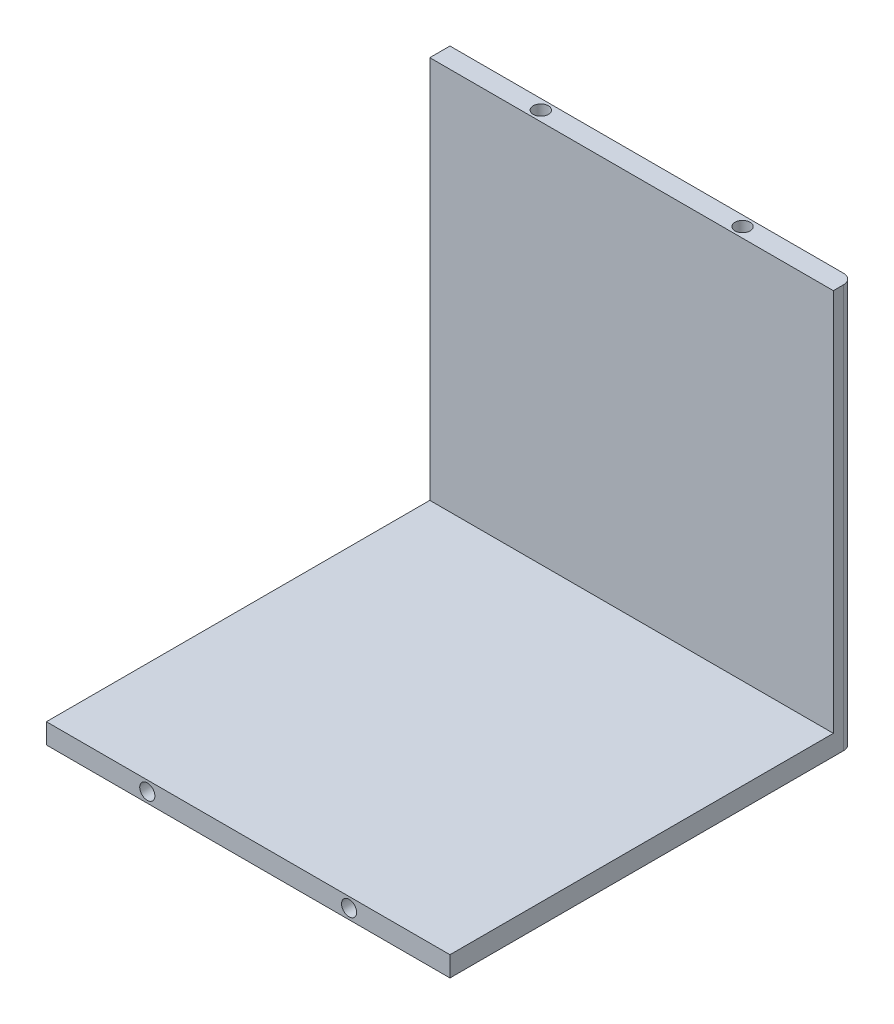
ISO-10303-21;
HEADER;
FILE_DESCRIPTION(('STEP AP214'),'2;1');
FILE_NAME('part.step','',(''),(''),'','','');
FILE_SCHEMA(('AUTOMOTIVE_DESIGN { 1 0 10303 214 1 1 1 1 }'));
ENDSEC;
DATA;
#1=APPLICATION_CONTEXT('core data for automotive mechanical design processes');
#2=APPLICATION_PROTOCOL_DEFINITION('international standard','automotive_design',2000,#1);
#3=PRODUCT_CONTEXT('',#1,'mechanical');
#4=PRODUCT('Part','Part','',(#3));
#5=PRODUCT_RELATED_PRODUCT_CATEGORY('part','',(#4));
#6=PRODUCT_DEFINITION_FORMATION('','',#4);
#7=PRODUCT_DEFINITION_CONTEXT('part definition',#1,'design');
#8=PRODUCT_DEFINITION('design','',#6,#7);
#9=PRODUCT_DEFINITION_SHAPE('','',#8);
#10=(LENGTH_UNIT() NAMED_UNIT(*) SI_UNIT(.MILLI.,.METRE.));
#11=(NAMED_UNIT(*) PLANE_ANGLE_UNIT() SI_UNIT($,.RADIAN.));
#12=(NAMED_UNIT(*) SI_UNIT($,.STERADIAN.) SOLID_ANGLE_UNIT());
#13=UNCERTAINTY_MEASURE_WITH_UNIT(LENGTH_MEASURE(1.E-05),#10,'distance_accuracy_value','');
#14=(GEOMETRIC_REPRESENTATION_CONTEXT(3) GLOBAL_UNCERTAINTY_ASSIGNED_CONTEXT((#13)) GLOBAL_UNIT_ASSIGNED_CONTEXT((#10,
#11,#12)) REPRESENTATION_CONTEXT('',''));
#15=CARTESIAN_POINT('',(0.,0.,0.));
#16=DIRECTION('',(0.,0.,1.));
#17=DIRECTION('',(1.,0.,0.));
#18=AXIS2_PLACEMENT_3D('',#15,#16,#17);
#19=CARTESIAN_POINT('',(80.,-2.,0.));
#20=DIRECTION('',(0.,-1.,0.));
#21=DIRECTION('',(0.,0.,-1.));
#22=AXIS2_PLACEMENT_3D('',#19,#20,#21);
#23=PLANE('',#22);
#24=CARTESIAN_POINT('',(76.25,-1.99999999999999,-103.5));
#25=DIRECTION('',(0.,-1.,0.));
#26=DIRECTION('',(0.,0.,-1.));
#27=AXIS2_PLACEMENT_3D('',#24,#25,#26);
#28=CIRCLE('',#27,0.749999999999999);
#29=CARTESIAN_POINT('',(76.25,-1.99999999999999,-104.25));
#30=VERTEX_POINT('',#29);
#31=EDGE_CURVE('E252',#30,#30,#28,.T.);
#32=ORIENTED_EDGE('',*,*,#31,.F.);
#33=EDGE_LOOP('',(#32));
#34=FACE_BOUND('',#33,.T.);
#35=DIRECTION('',(0.,0.,1.));
#36=VECTOR('',#35,1.);
#37=CARTESIAN_POINT('',(80.,-2.,0.));
#38=LINE('',#37,#36);
#39=CARTESIAN_POINT('',(80.,-1.99999999999999,-109.));
#40=VERTEX_POINT('',#39);
#41=CARTESIAN_POINT('',(80.,-2.,-70.));
#42=VERTEX_POINT('',#41);
#43=EDGE_CURVE('E151',#40,#42,#38,.T.);
#44=ORIENTED_EDGE('',*,*,#43,.T.);
#45=DIRECTION('',(1.,0.,0.));
#46=VECTOR('',#45,1.);
#47=CARTESIAN_POINT('',(40.,-2.,-70.));
#48=LINE('',#47,#46);
#49=CARTESIAN_POINT('',(40.,-2.,-70.));
#50=VERTEX_POINT('',#49);
#51=EDGE_CURVE('E137',#50,#42,#48,.T.);
#52=ORIENTED_EDGE('',*,*,#51,.F.);
#53=DIRECTION('',(0.,0.,1.));
#54=VECTOR('',#53,1.);
#55=CARTESIAN_POINT('',(40.,-2.,-110.));
#56=LINE('',#55,#54);
#57=CARTESIAN_POINT('',(40.,-2.,-110.));
#58=VERTEX_POINT('',#57);
#59=EDGE_CURVE('E148',#58,#50,#56,.T.);
#60=ORIENTED_EDGE('',*,*,#59,.F.);
#61=DIRECTION('',(-1.,0.,0.));
#62=VECTOR('',#61,1.);
#63=CARTESIAN_POINT('',(80.,-1.99999999999999,-110.));
#64=LINE('',#63,#62);
#65=CARTESIAN_POINT('',(79.,-1.99999999999999,-110.));
#66=VERTEX_POINT('',#65);
#67=EDGE_CURVE('E182',#66,#58,#64,.T.);
#68=ORIENTED_EDGE('',*,*,#67,.F.);
#69=CARTESIAN_POINT('',(79.,-1.99999999999999,-109.));
#70=DIRECTION('',(0.,-1.,0.));
#71=DIRECTION('',(0.,0.,-1.));
#72=AXIS2_PLACEMENT_3D('',#69,#70,#71);
#73=CIRCLE('',#72,1.);
#74=EDGE_CURVE('E184',#66,#40,#73,.T.);
#75=ORIENTED_EDGE('',*,*,#74,.T.);
#76=EDGE_LOOP('',(#44,#52,#60,#68,#75));
#77=FACE_BOUND('',#76,.T.);
#78=ADVANCED_FACE('F79',(#34,#77),#23,.T.);
#79=CARTESIAN_POINT('',(80.,0.,0.));
#80=DIRECTION('',(0.,1.,0.));
#81=DIRECTION('',(0.,0.,1.));
#82=AXIS2_PLACEMENT_3D('',#79,#80,#81);
#83=PLANE('',#82);
#84=DIRECTION('',(0.,0.,1.));
#85=VECTOR('',#84,1.);
#86=CARTESIAN_POINT('',(40.,0.,0.));
#87=LINE('',#86,#85);
#88=CARTESIAN_POINT('',(40.,0.,-108.));
#89=VERTEX_POINT('',#88);
#90=CARTESIAN_POINT('',(40.,0.,-70.));
#91=VERTEX_POINT('',#90);
#92=EDGE_CURVE('E168',#89,#91,#87,.T.);
#93=ORIENTED_EDGE('',*,*,#92,.T.);
#94=DIRECTION('',(-1.,0.,0.));
#95=VECTOR('',#94,1.);
#96=CARTESIAN_POINT('',(40.,0.,-70.));
#97=LINE('',#96,#95);
#98=CARTESIAN_POINT('',(80.,0.,-70.));
#99=VERTEX_POINT('',#98);
#100=EDGE_CURVE('E94',#99,#91,#97,.T.);
#101=ORIENTED_EDGE('',*,*,#100,.F.);
#102=DIRECTION('',(0.,0.,-1.));
#103=VECTOR('',#102,1.);
#104=CARTESIAN_POINT('',(80.,0.,0.));
#105=LINE('',#104,#103);
#106=CARTESIAN_POINT('',(80.,0.,-108.));
#107=VERTEX_POINT('',#106);
#108=EDGE_CURVE('E177',#99,#107,#105,.T.);
#109=ORIENTED_EDGE('',*,*,#108,.T.);
#110=DIRECTION('',(-1.,0.,0.));
#111=VECTOR('',#110,1.);
#112=CARTESIAN_POINT('',(80.,0.,-108.));
#113=LINE('',#112,#111);
#114=EDGE_CURVE('E179',#107,#89,#113,.T.);
#115=ORIENTED_EDGE('',*,*,#114,.T.);
#116=EDGE_LOOP('',(#93,#101,#109,#115));
#117=FACE_BOUND('',#116,.T.);
#118=ADVANCED_FACE('F268',(#117),#83,.T.);
#119=CARTESIAN_POINT('',(80.,0.,0.));
#120=DIRECTION('',(1.,0.,0.));
#121=DIRECTION('',(0.,0.,-1.));
#122=AXIS2_PLACEMENT_3D('',#119,#120,#121);
#123=PLANE('',#122);
#124=ORIENTED_EDGE('',*,*,#108,.F.);
#125=DIRECTION('',(0.,1.,0.));
#126=VECTOR('',#125,1.);
#127=CARTESIAN_POINT('',(80.,0.,-70.));
#128=LINE('',#127,#126);
#129=EDGE_CURVE('E152',#42,#99,#128,.T.);
#130=ORIENTED_EDGE('',*,*,#129,.F.);
#131=ORIENTED_EDGE('',*,*,#43,.F.);
#132=DIRECTION('',(0.,-1.,0.));
#133=VECTOR('',#132,1.);
#134=CARTESIAN_POINT('',(80.,0.,-109.));
#135=LINE('',#134,#133);
#136=CARTESIAN_POINT('',(80.,38.,-109.));
#137=VERTEX_POINT('',#136);
#138=EDGE_CURVE('E87',#40,#137,#135,.F.);
#139=ORIENTED_EDGE('',*,*,#138,.T.);
#140=DIRECTION('',(0.,0.,1.));
#141=VECTOR('',#140,1.);
#142=CARTESIAN_POINT('',(80.,38.,-110.));
#143=LINE('',#142,#141);
#144=CARTESIAN_POINT('',(80.,38.,-108.));
#145=VERTEX_POINT('',#144);
#146=EDGE_CURVE('E101',#137,#145,#143,.T.);
#147=ORIENTED_EDGE('',*,*,#146,.T.);
#148=DIRECTION('',(0.,1.,0.));
#149=VECTOR('',#148,1.);
#150=CARTESIAN_POINT('',(80.,0.,-108.));
#151=LINE('',#150,#149);
#152=EDGE_CURVE('E174',#107,#145,#151,.T.);
#153=ORIENTED_EDGE('',*,*,#152,.F.);
#154=EDGE_LOOP('',(#124,#130,#131,#139,#147,#153));
#155=FACE_BOUND('',#154,.T.);
#156=ADVANCED_FACE('F191',(#155),#123,.T.);
#157=CARTESIAN_POINT('',(40.,0.,-110.));
#158=DIRECTION('',(-1.,0.,0.));
#159=DIRECTION('',(0.,-1.,0.));
#160=AXIS2_PLACEMENT_3D('',#157,#158,#159);
#161=PLANE('',#160);
#162=CARTESIAN_POINT('',(40.,28.,-109.));
#163=DIRECTION('',(-1.,0.,0.));
#164=DIRECTION('',(0.,-1.,0.));
#165=AXIS2_PLACEMENT_3D('',#162,#163,#164);
#166=CIRCLE('',#165,0.749999999999999);
#167=CARTESIAN_POINT('',(40.,27.25,-109.));
#168=VERTEX_POINT('',#167);
#169=EDGE_CURVE('E247',#168,#168,#166,.T.);
#170=ORIENTED_EDGE('',*,*,#169,.F.);
#171=EDGE_LOOP('',(#170));
#172=FACE_BOUND('',#171,.T.);
#173=CARTESIAN_POINT('',(40.,8.,-109.));
#174=DIRECTION('',(-1.,0.,0.));
#175=DIRECTION('',(0.,-1.,0.));
#176=AXIS2_PLACEMENT_3D('',#173,#174,#175);
#177=CIRCLE('',#176,0.749999999999999);
#178=CARTESIAN_POINT('',(40.,7.25,-109.));
#179=VERTEX_POINT('',#178);
#180=EDGE_CURVE('E243',#179,#179,#177,.T.);
#181=ORIENTED_EDGE('',*,*,#180,.F.);
#182=EDGE_LOOP('',(#181));
#183=FACE_BOUND('',#182,.T.);
#184=CARTESIAN_POINT('',(40.,-0.999999999999999,-99.9946941613957));
#185=DIRECTION('',(-1.,0.,0.));
#186=DIRECTION('',(0.,0.,1.));
#187=AXIS2_PLACEMENT_3D('',#184,#185,#186);
#188=CIRCLE('',#187,0.749999999999999);
#189=CARTESIAN_POINT('',(40.,-0.999999999999999,-99.2446941613957));
#190=VERTEX_POINT('',#189);
#191=EDGE_CURVE('E223',#190,#190,#188,.T.);
#192=ORIENTED_EDGE('',*,*,#191,.F.);
#193=EDGE_LOOP('',(#192));
#194=FACE_BOUND('',#193,.T.);
#195=CARTESIAN_POINT('',(40.,-1.,-79.9946941613957));
#196=DIRECTION('',(-1.,0.,0.));
#197=DIRECTION('',(0.,0.,1.));
#198=AXIS2_PLACEMENT_3D('',#195,#196,#197);
#199=CIRCLE('',#198,0.749999999999999);
#200=CARTESIAN_POINT('',(40.,-1.,-79.2446941613957));
#201=VERTEX_POINT('',#200);
#202=EDGE_CURVE('E216',#201,#201,#199,.T.);
#203=ORIENTED_EDGE('',*,*,#202,.F.);
#204=EDGE_LOOP('',(#203));
#205=FACE_BOUND('',#204,.T.);
#206=ORIENTED_EDGE('',*,*,#59,.T.);
#207=DIRECTION('',(0.,-1.,0.));
#208=VECTOR('',#207,1.);
#209=CARTESIAN_POINT('',(40.,0.,-70.));
#210=LINE('',#209,#208);
#211=EDGE_CURVE('E134',#91,#50,#210,.T.);
#212=ORIENTED_EDGE('',*,*,#211,.F.);
#213=ORIENTED_EDGE('',*,*,#92,.F.);
#214=DIRECTION('',(0.,-1.,0.));
#215=VECTOR('',#214,1.);
#216=CARTESIAN_POINT('',(40.,0.,-108.));
#217=LINE('',#216,#215);
#218=CARTESIAN_POINT('',(40.,38.,-108.));
#219=VERTEX_POINT('',#218);
#220=EDGE_CURVE('E170',#219,#89,#217,.T.);
#221=ORIENTED_EDGE('',*,*,#220,.F.);
#222=DIRECTION('',(0.,0.,1.));
#223=VECTOR('',#222,1.);
#224=CARTESIAN_POINT('',(40.,38.,-110.));
#225=LINE('',#224,#223);
#226=CARTESIAN_POINT('',(40.,38.,-110.));
#227=VERTEX_POINT('',#226);
#228=EDGE_CURVE('E157',#227,#219,#225,.T.);
#229=ORIENTED_EDGE('',*,*,#228,.F.);
#230=DIRECTION('',(0.,-1.,0.));
#231=VECTOR('',#230,1.);
#232=CARTESIAN_POINT('',(40.,0.,-110.));
#233=LINE('',#232,#231);
#234=EDGE_CURVE('E156',#227,#58,#233,.T.);
#235=ORIENTED_EDGE('',*,*,#234,.T.);
#236=EDGE_LOOP('',(#206,#212,#213,#221,#229,#235));
#237=FACE_BOUND('',#236,.T.);
#238=ADVANCED_FACE('F154',(#172,#183,#194,#205,#237),#161,.T.);
#239=CARTESIAN_POINT('',(80.,0.,-110.));
#240=DIRECTION('',(0.,0.,-1.));
#241=DIRECTION('',(0.,1.,0.));
#242=AXIS2_PLACEMENT_3D('',#239,#240,#241);
#243=PLANE('',#242);
#244=DIRECTION('',(1.,0.,0.));
#245=VECTOR('',#244,1.);
#246=CARTESIAN_POINT('',(0.,38.,-110.));
#247=LINE('',#246,#245);
#248=CARTESIAN_POINT('',(79.,38.,-110.));
#249=VERTEX_POINT('',#248);
#250=EDGE_CURVE('E158',#227,#249,#247,.T.);
#251=ORIENTED_EDGE('',*,*,#250,.T.);
#252=DIRECTION('',(0.,-1.,0.));
#253=VECTOR('',#252,1.);
#254=CARTESIAN_POINT('',(79.,0.,-110.));
#255=LINE('',#254,#253);
#256=EDGE_CURVE('E186',#249,#66,#255,.T.);
#257=ORIENTED_EDGE('',*,*,#256,.T.);
#258=ORIENTED_EDGE('',*,*,#67,.T.);
#259=ORIENTED_EDGE('',*,*,#234,.F.);
#260=EDGE_LOOP('',(#251,#257,#258,#259));
#261=FACE_BOUND('',#260,.T.);
#262=ADVANCED_FACE('F199',(#261),#243,.T.);
#263=CARTESIAN_POINT('',(80.,0.,-108.));
#264=DIRECTION('',(0.,0.,1.));
#265=DIRECTION('',(1.,0.,0.));
#266=AXIS2_PLACEMENT_3D('',#263,#264,#265);
#267=PLANE('',#266);
#268=DIRECTION('',(1.,0.,0.));
#269=VECTOR('',#268,1.);
#270=CARTESIAN_POINT('',(80.,38.,-108.));
#271=LINE('',#270,#269);
#272=EDGE_CURVE('E166',#219,#145,#271,.T.);
#273=ORIENTED_EDGE('',*,*,#272,.F.);
#274=ORIENTED_EDGE('',*,*,#220,.T.);
#275=ORIENTED_EDGE('',*,*,#114,.F.);
#276=ORIENTED_EDGE('',*,*,#152,.T.);
#277=EDGE_LOOP('',(#273,#274,#275,#276));
#278=FACE_BOUND('',#277,.T.);
#279=ADVANCED_FACE('F277',(#278),#267,.T.);
#280=CARTESIAN_POINT('',(79.,0.,-109.));
#281=DIRECTION('',(0.,-1.,0.));
#282=DIRECTION('',(0.,0.,-1.));
#283=AXIS2_PLACEMENT_3D('',#280,#281,#282);
#284=CYLINDRICAL_SURFACE('',#283,1.);
#285=CARTESIAN_POINT('',(79.,38.,-109.));
#286=DIRECTION('',(0.,-1.,0.));
#287=DIRECTION('',(1.,0.,0.));
#288=AXIS2_PLACEMENT_3D('',#285,#286,#287);
#289=CIRCLE('',#288,1.);
#290=EDGE_CURVE('E12',#137,#249,#289,.F.);
#291=ORIENTED_EDGE('',*,*,#290,.F.);
#292=ORIENTED_EDGE('',*,*,#138,.F.);
#293=ORIENTED_EDGE('',*,*,#74,.F.);
#294=ORIENTED_EDGE('',*,*,#256,.F.);
#295=EDGE_LOOP('',(#291,#292,#293,#294));
#296=FACE_BOUND('',#295,.T.);
#297=ADVANCED_FACE('F81',(#296),#284,.T.);
#298=CARTESIAN_POINT('',(0.,38.,-110.));
#299=DIRECTION('',(0.,-1.,0.));
#300=DIRECTION('',(1.,0.,0.));
#301=AXIS2_PLACEMENT_3D('',#298,#299,#300);
#302=PLANE('',#301);
#303=CARTESIAN_POINT('',(70.,38.,-109.));
#304=DIRECTION('',(0.,1.,0.));
#305=DIRECTION('',(-1.,0.,0.));
#306=AXIS2_PLACEMENT_3D('',#303,#304,#305);
#307=CIRCLE('',#306,0.749999999999999);
#308=CARTESIAN_POINT('',(69.25,38.,-109.));
#309=VERTEX_POINT('',#308);
#310=EDGE_CURVE('E235',#309,#309,#307,.T.);
#311=ORIENTED_EDGE('',*,*,#310,.F.);
#312=EDGE_LOOP('',(#311));
#313=FACE_BOUND('',#312,.T.);
#314=CARTESIAN_POINT('',(50.,38.,-109.));
#315=DIRECTION('',(0.,1.,0.));
#316=DIRECTION('',(-1.,0.,0.));
#317=AXIS2_PLACEMENT_3D('',#314,#315,#316);
#318=CIRCLE('',#317,0.749999999999999);
#319=CARTESIAN_POINT('',(49.25,38.,-109.));
#320=VERTEX_POINT('',#319);
#321=EDGE_CURVE('E231',#320,#320,#318,.T.);
#322=ORIENTED_EDGE('',*,*,#321,.F.);
#323=EDGE_LOOP('',(#322));
#324=FACE_BOUND('',#323,.T.);
#325=ORIENTED_EDGE('',*,*,#272,.T.);
#326=ORIENTED_EDGE('',*,*,#146,.F.);
#327=ORIENTED_EDGE('',*,*,#290,.T.);
#328=ORIENTED_EDGE('',*,*,#250,.F.);
#329=ORIENTED_EDGE('',*,*,#228,.T.);
#330=EDGE_LOOP('',(#325,#326,#327,#328,#329));
#331=FACE_BOUND('',#330,.T.);
#332=ADVANCED_FACE('F197',(#313,#324,#331),#302,.F.);
#333=CARTESIAN_POINT('',(0.,0.,-70.));
#334=DIRECTION('',(0.,0.,1.));
#335=DIRECTION('',(1.,0.,0.));
#336=AXIS2_PLACEMENT_3D('',#333,#334,#335);
#337=PLANE('',#336);
#338=CARTESIAN_POINT('',(50.,-1.,-70.));
#339=DIRECTION('',(0.,0.,1.));
#340=DIRECTION('',(1.,0.,0.));
#341=AXIS2_PLACEMENT_3D('',#338,#339,#340);
#342=CIRCLE('',#341,0.749999999999999);
#343=CARTESIAN_POINT('',(50.75,-1.,-70.));
#344=VERTEX_POINT('',#343);
#345=EDGE_CURVE('E211',#344,#344,#342,.T.);
#346=ORIENTED_EDGE('',*,*,#345,.F.);
#347=EDGE_LOOP('',(#346));
#348=FACE_BOUND('',#347,.T.);
#349=CARTESIAN_POINT('',(70.,-1.,-70.));
#350=DIRECTION('',(0.,0.,1.));
#351=DIRECTION('',(1.,0.,0.));
#352=AXIS2_PLACEMENT_3D('',#349,#350,#351);
#353=CIRCLE('',#352,0.749999999999999);
#354=CARTESIAN_POINT('',(70.75,-1.,-70.));
#355=VERTEX_POINT('',#354);
#356=EDGE_CURVE('E207',#355,#355,#353,.T.);
#357=ORIENTED_EDGE('',*,*,#356,.F.);
#358=EDGE_LOOP('',(#357));
#359=FACE_BOUND('',#358,.T.);
#360=ORIENTED_EDGE('',*,*,#211,.T.);
#361=ORIENTED_EDGE('',*,*,#51,.T.);
#362=ORIENTED_EDGE('',*,*,#129,.T.);
#363=ORIENTED_EDGE('',*,*,#100,.T.);
#364=EDGE_LOOP('',(#360,#361,#362,#363));
#365=FACE_BOUND('',#364,.T.);
#366=ADVANCED_FACE('F136',(#348,#359,#365),#337,.T.);
#367=CARTESIAN_POINT('',(70.,-1.,-75.));
#368=DIRECTION('',(0.,0.,1.));
#369=DIRECTION('',(1.,0.,0.));
#370=AXIS2_PLACEMENT_3D('',#367,#368,#369);
#371=CYLINDRICAL_SURFACE('',#370,0.749999999999999);
#372=CARTESIAN_POINT('',(70.,-1.,-75.));
#373=DIRECTION('',(0.,0.,1.));
#374=DIRECTION('',(1.,0.,0.));
#375=AXIS2_PLACEMENT_3D('',#372,#373,#374);
#376=CIRCLE('',#375,0.749999999999999);
#377=CARTESIAN_POINT('',(70.75,-1.,-75.));
#378=VERTEX_POINT('',#377);
#379=EDGE_CURVE('E204',#378,#378,#376,.T.);
#380=ORIENTED_EDGE('',*,*,#379,.F.);
#381=EDGE_LOOP('',(#380));
#382=FACE_BOUND('',#381,.T.);
#383=ORIENTED_EDGE('',*,*,#356,.T.);
#384=EDGE_LOOP('',(#383));
#385=FACE_BOUND('',#384,.T.);
#386=ADVANCED_FACE('F291',(#382,#385),#371,.F.);
#387=CARTESIAN_POINT('',(70.,-1.,-75.));
#388=DIRECTION('',(0.,0.,1.));
#389=DIRECTION('',(1.,0.,0.));
#390=AXIS2_PLACEMENT_3D('',#387,#388,#389);
#391=PLANE('',#390);
#392=ORIENTED_EDGE('',*,*,#379,.T.);
#393=EDGE_LOOP('',(#392));
#394=FACE_BOUND('',#393,.T.);
#395=ADVANCED_FACE('F293',(#394),#391,.T.);
#396=CARTESIAN_POINT('',(50.,-1.,-75.));
#397=DIRECTION('',(0.,0.,1.));
#398=DIRECTION('',(1.,0.,0.));
#399=AXIS2_PLACEMENT_3D('',#396,#397,#398);
#400=CYLINDRICAL_SURFACE('',#399,0.749999999999999);
#401=CARTESIAN_POINT('',(50.,-1.,-75.));
#402=DIRECTION('',(0.,0.,1.));
#403=DIRECTION('',(1.,0.,0.));
#404=AXIS2_PLACEMENT_3D('',#401,#402,#403);
#405=CIRCLE('',#404,0.749999999999999);
#406=CARTESIAN_POINT('',(50.75,-1.,-75.));
#407=VERTEX_POINT('',#406);
#408=EDGE_CURVE('E142',#407,#407,#405,.T.);
#409=ORIENTED_EDGE('',*,*,#408,.F.);
#410=EDGE_LOOP('',(#409));
#411=FACE_BOUND('',#410,.T.);
#412=ORIENTED_EDGE('',*,*,#345,.T.);
#413=EDGE_LOOP('',(#412));
#414=FACE_BOUND('',#413,.T.);
#415=ADVANCED_FACE('F296',(#411,#414),#400,.F.);
#416=CARTESIAN_POINT('',(50.,-1.,-75.));
#417=DIRECTION('',(0.,0.,1.));
#418=DIRECTION('',(1.,0.,0.));
#419=AXIS2_PLACEMENT_3D('',#416,#417,#418);
#420=PLANE('',#419);
#421=ORIENTED_EDGE('',*,*,#408,.T.);
#422=EDGE_LOOP('',(#421));
#423=FACE_BOUND('',#422,.T.);
#424=ADVANCED_FACE('F303',(#423),#420,.T.);
#425=CARTESIAN_POINT('',(45.,-1.,-79.9946941613957));
#426=DIRECTION('',(-1.,0.,0.));
#427=DIRECTION('',(0.,0.,1.));
#428=AXIS2_PLACEMENT_3D('',#425,#426,#427);
#429=CYLINDRICAL_SURFACE('',#428,0.749999999999999);
#430=CARTESIAN_POINT('',(45.,-1.,-79.9946941613957));
#431=DIRECTION('',(-1.,0.,0.));
#432=DIRECTION('',(0.,0.,1.));
#433=AXIS2_PLACEMENT_3D('',#430,#431,#432);
#434=CIRCLE('',#433,0.749999999999999);
#435=CARTESIAN_POINT('',(45.,-1.,-79.2446941613957));
#436=VERTEX_POINT('',#435);
#437=EDGE_CURVE('E219',#436,#436,#434,.T.);
#438=ORIENTED_EDGE('',*,*,#437,.F.);
#439=EDGE_LOOP('',(#438));
#440=FACE_BOUND('',#439,.T.);
#441=ORIENTED_EDGE('',*,*,#202,.T.);
#442=EDGE_LOOP('',(#441));
#443=FACE_BOUND('',#442,.T.);
#444=ADVANCED_FACE('F307',(#440,#443),#429,.F.);
#445=CARTESIAN_POINT('',(45.,-1.,-79.9946941613957));
#446=DIRECTION('',(-1.,0.,0.));
#447=DIRECTION('',(0.,0.,1.));
#448=AXIS2_PLACEMENT_3D('',#445,#446,#447);
#449=PLANE('',#448);
#450=ORIENTED_EDGE('',*,*,#437,.T.);
#451=EDGE_LOOP('',(#450));
#452=FACE_BOUND('',#451,.T.);
#453=ADVANCED_FACE('F311',(#452),#449,.T.);
#454=CARTESIAN_POINT('',(45.,-1.,-99.9946941613957));
#455=DIRECTION('',(-1.,0.,0.));
#456=DIRECTION('',(0.,0.,1.));
#457=AXIS2_PLACEMENT_3D('',#454,#455,#456);
#458=CYLINDRICAL_SURFACE('',#457,0.749999999999999);
#459=CARTESIAN_POINT('',(45.,-1.,-99.9946941613957));
#460=DIRECTION('',(-1.,0.,0.));
#461=DIRECTION('',(0.,0.,1.));
#462=AXIS2_PLACEMENT_3D('',#459,#460,#461);
#463=CIRCLE('',#462,0.749999999999999);
#464=CARTESIAN_POINT('',(45.,-1.,-99.2446941613957));
#465=VERTEX_POINT('',#464);
#466=EDGE_CURVE('E208',#465,#465,#463,.T.);
#467=ORIENTED_EDGE('',*,*,#466,.F.);
#468=EDGE_LOOP('',(#467));
#469=FACE_BOUND('',#468,.T.);
#470=ORIENTED_EDGE('',*,*,#191,.T.);
#471=EDGE_LOOP('',(#470));
#472=FACE_BOUND('',#471,.T.);
#473=ADVANCED_FACE('F315',(#469,#472),#458,.F.);
#474=CARTESIAN_POINT('',(45.,-1.,-99.9946941613957));
#475=DIRECTION('',(-1.,0.,0.));
#476=DIRECTION('',(0.,0.,1.));
#477=AXIS2_PLACEMENT_3D('',#474,#475,#476);
#478=PLANE('',#477);
#479=ORIENTED_EDGE('',*,*,#466,.T.);
#480=EDGE_LOOP('',(#479));
#481=FACE_BOUND('',#480,.T.);
#482=ADVANCED_FACE('F319',(#481),#478,.T.);
#483=CARTESIAN_POINT('',(50.,33.,-109.));
#484=DIRECTION('',(0.,1.,0.));
#485=DIRECTION('',(-1.,0.,0.));
#486=AXIS2_PLACEMENT_3D('',#483,#484,#485);
#487=CYLINDRICAL_SURFACE('',#486,0.749999999999999);
#488=CARTESIAN_POINT('',(50.,33.,-109.));
#489=DIRECTION('',(0.,1.,0.));
#490=DIRECTION('',(-1.,0.,0.));
#491=AXIS2_PLACEMENT_3D('',#488,#489,#490);
#492=CIRCLE('',#491,0.749999999999999);
#493=CARTESIAN_POINT('',(49.25,33.,-109.));
#494=VERTEX_POINT('',#493);
#495=EDGE_CURVE('E228',#494,#494,#492,.T.);
#496=ORIENTED_EDGE('',*,*,#495,.F.);
#497=EDGE_LOOP('',(#496));
#498=FACE_BOUND('',#497,.T.);
#499=ORIENTED_EDGE('',*,*,#321,.T.);
#500=EDGE_LOOP('',(#499));
#501=FACE_BOUND('',#500,.T.);
#502=ADVANCED_FACE('F323',(#498,#501),#487,.F.);
#503=CARTESIAN_POINT('',(50.,33.,-109.));
#504=DIRECTION('',(0.,1.,0.));
#505=DIRECTION('',(-1.,0.,0.));
#506=AXIS2_PLACEMENT_3D('',#503,#504,#505);
#507=PLANE('',#506);
#508=ORIENTED_EDGE('',*,*,#495,.T.);
#509=EDGE_LOOP('',(#508));
#510=FACE_BOUND('',#509,.T.);
#511=ADVANCED_FACE('F325',(#510),#507,.T.);
#512=CARTESIAN_POINT('',(70.,33.,-109.));
#513=DIRECTION('',(0.,1.,0.));
#514=DIRECTION('',(-1.,0.,0.));
#515=AXIS2_PLACEMENT_3D('',#512,#513,#514);
#516=CYLINDRICAL_SURFACE('',#515,0.749999999999999);
#517=CARTESIAN_POINT('',(70.,33.,-109.));
#518=DIRECTION('',(0.,1.,0.));
#519=DIRECTION('',(-1.,0.,0.));
#520=AXIS2_PLACEMENT_3D('',#517,#518,#519);
#521=CIRCLE('',#520,0.749999999999999);
#522=CARTESIAN_POINT('',(69.25,33.,-109.));
#523=VERTEX_POINT('',#522);
#524=EDGE_CURVE('E220',#523,#523,#521,.T.);
#525=ORIENTED_EDGE('',*,*,#524,.F.);
#526=EDGE_LOOP('',(#525));
#527=FACE_BOUND('',#526,.T.);
#528=ORIENTED_EDGE('',*,*,#310,.T.);
#529=EDGE_LOOP('',(#528));
#530=FACE_BOUND('',#529,.T.);
#531=ADVANCED_FACE('F328',(#527,#530),#516,.F.);
#532=CARTESIAN_POINT('',(70.,33.,-109.));
#533=DIRECTION('',(0.,1.,0.));
#534=DIRECTION('',(-1.,0.,0.));
#535=AXIS2_PLACEMENT_3D('',#532,#533,#534);
#536=PLANE('',#535);
#537=ORIENTED_EDGE('',*,*,#524,.T.);
#538=EDGE_LOOP('',(#537));
#539=FACE_BOUND('',#538,.T.);
#540=ADVANCED_FACE('F335',(#539),#536,.T.);
#541=CARTESIAN_POINT('',(45.,8.,-109.));
#542=DIRECTION('',(-1.,0.,0.));
#543=DIRECTION('',(0.,-1.,0.));
#544=AXIS2_PLACEMENT_3D('',#541,#542,#543);
#545=CYLINDRICAL_SURFACE('',#544,0.749999999999999);
#546=CARTESIAN_POINT('',(45.,8.,-109.));
#547=DIRECTION('',(-1.,0.,0.));
#548=DIRECTION('',(0.,-1.,0.));
#549=AXIS2_PLACEMENT_3D('',#546,#547,#548);
#550=CIRCLE('',#549,0.749999999999999);
#551=CARTESIAN_POINT('',(45.,7.25,-109.));
#552=VERTEX_POINT('',#551);
#553=EDGE_CURVE('E240',#552,#552,#550,.T.);
#554=ORIENTED_EDGE('',*,*,#553,.F.);
#555=EDGE_LOOP('',(#554));
#556=FACE_BOUND('',#555,.T.);
#557=ORIENTED_EDGE('',*,*,#180,.T.);
#558=EDGE_LOOP('',(#557));
#559=FACE_BOUND('',#558,.T.);
#560=ADVANCED_FACE('F339',(#556,#559),#545,.F.);
#561=CARTESIAN_POINT('',(45.,8.,-109.));
#562=DIRECTION('',(-1.,0.,0.));
#563=DIRECTION('',(0.,-1.,0.));
#564=AXIS2_PLACEMENT_3D('',#561,#562,#563);
#565=PLANE('',#564);
#566=ORIENTED_EDGE('',*,*,#553,.T.);
#567=EDGE_LOOP('',(#566));
#568=FACE_BOUND('',#567,.T.);
#569=ADVANCED_FACE('F341',(#568),#565,.T.);
#570=CARTESIAN_POINT('',(45.,28.,-109.));
#571=DIRECTION('',(-1.,0.,0.));
#572=DIRECTION('',(0.,-1.,0.));
#573=AXIS2_PLACEMENT_3D('',#570,#571,#572);
#574=CYLINDRICAL_SURFACE('',#573,0.749999999999999);
#575=CARTESIAN_POINT('',(45.,28.,-109.));
#576=DIRECTION('',(-1.,0.,0.));
#577=DIRECTION('',(0.,-1.,0.));
#578=AXIS2_PLACEMENT_3D('',#575,#576,#577);
#579=CIRCLE('',#578,0.749999999999999);
#580=CARTESIAN_POINT('',(45.,27.25,-109.));
#581=VERTEX_POINT('',#580);
#582=EDGE_CURVE('E232',#581,#581,#579,.T.);
#583=ORIENTED_EDGE('',*,*,#582,.F.);
#584=EDGE_LOOP('',(#583));
#585=FACE_BOUND('',#584,.T.);
#586=ORIENTED_EDGE('',*,*,#169,.T.);
#587=EDGE_LOOP('',(#586));
#588=FACE_BOUND('',#587,.T.);
#589=ADVANCED_FACE('F344',(#585,#588),#574,.F.);
#590=CARTESIAN_POINT('',(45.,28.,-109.));
#591=DIRECTION('',(-1.,0.,0.));
#592=DIRECTION('',(0.,-1.,0.));
#593=AXIS2_PLACEMENT_3D('',#590,#591,#592);
#594=PLANE('',#593);
#595=ORIENTED_EDGE('',*,*,#582,.T.);
#596=EDGE_LOOP('',(#595));
#597=FACE_BOUND('',#596,.T.);
#598=ADVANCED_FACE('F263',(#597),#594,.T.);
#599=CARTESIAN_POINT('',(76.25,-0.999999999999987,-103.5));
#600=DIRECTION('',(0.,-1.,0.));
#601=DIRECTION('',(0.,0.,-1.));
#602=AXIS2_PLACEMENT_3D('',#599,#600,#601);
#603=CYLINDRICAL_SURFACE('',#602,0.749999999999999);
#604=CARTESIAN_POINT('',(76.25,-0.999999999999987,-103.5));
#605=DIRECTION('',(0.,-1.,0.));
#606=DIRECTION('',(0.,0.,-1.));
#607=AXIS2_PLACEMENT_3D('',#604,#605,#606);
#608=CIRCLE('',#607,0.749999999999999);
#609=CARTESIAN_POINT('',(76.25,-0.999999999999987,-104.25));
#610=VERTEX_POINT('',#609);
#611=EDGE_CURVE('E244',#610,#610,#608,.T.);
#612=ORIENTED_EDGE('',*,*,#611,.F.);
#613=EDGE_LOOP('',(#612));
#614=FACE_BOUND('',#613,.T.);
#615=ORIENTED_EDGE('',*,*,#31,.T.);
#616=EDGE_LOOP('',(#615));
#617=FACE_BOUND('',#616,.T.);
#618=ADVANCED_FACE('F260',(#614,#617),#603,.F.);
#619=CARTESIAN_POINT('',(76.25,-0.999999999999987,-103.5));
#620=DIRECTION('',(0.,-1.,0.));
#621=DIRECTION('',(0.,0.,-1.));
#622=AXIS2_PLACEMENT_3D('',#619,#620,#621);
#623=PLANE('',#622);
#624=ORIENTED_EDGE('',*,*,#611,.T.);
#625=EDGE_LOOP('',(#624));
#626=FACE_BOUND('',#625,.T.);
#627=ADVANCED_FACE('F258',(#626),#623,.T.);
#628=CLOSED_SHELL('',(#78,#118,#156,#238,#262,#279,#297,#332,#366,#386,#395,#415,#424,#444,#453,
#473,#482,#502,#511,#531,#540,#560,#569,#589,#598,#618,#627));
#629=MANIFOLD_SOLID_BREP('B2',#628);
#630=ADVANCED_BREP_SHAPE_REPRESENTATION('',(#18,#629),#14);
#631=SHAPE_DEFINITION_REPRESENTATION(#9,#630);
ENDSEC;
END-ISO-10303-21;
